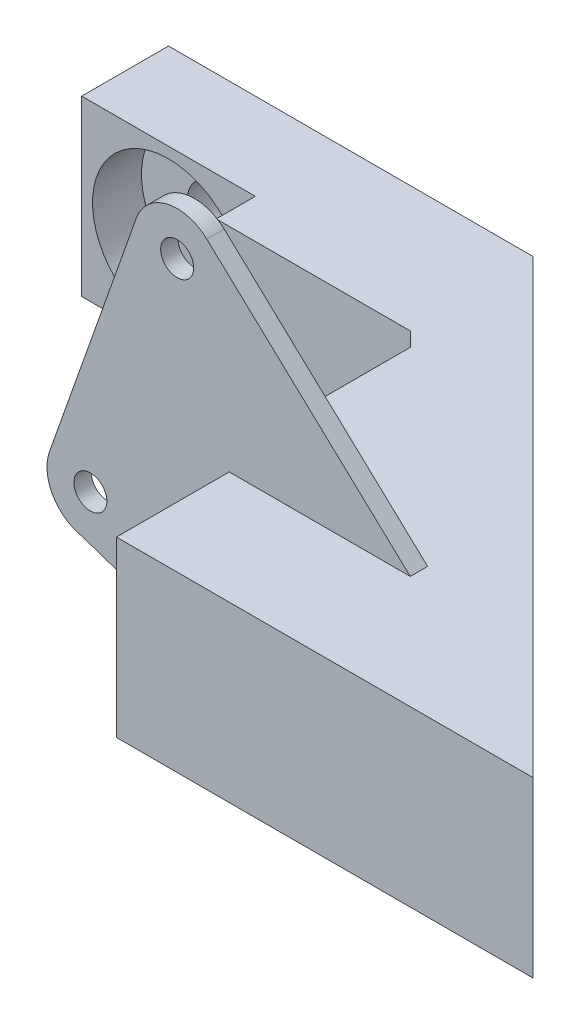
ISO-10303-21;
HEADER;
FILE_DESCRIPTION(('STEP AP214'),'2;1');
FILE_NAME('part.step','',(''),(''),'','','');
FILE_SCHEMA(('AUTOMOTIVE_DESIGN { 1 0 10303 214 1 1 1 1 }'));
ENDSEC;
DATA;
#1=APPLICATION_CONTEXT('core data for automotive mechanical design processes');
#2=APPLICATION_PROTOCOL_DEFINITION('international standard','automotive_design',2000,#1);
#3=PRODUCT_CONTEXT('',#1,'mechanical');
#4=PRODUCT('Part','Part','',(#3));
#5=PRODUCT_RELATED_PRODUCT_CATEGORY('part','',(#4));
#6=PRODUCT_DEFINITION_FORMATION('','',#4);
#7=PRODUCT_DEFINITION_CONTEXT('part definition',#1,'design');
#8=PRODUCT_DEFINITION('design','',#6,#7);
#9=PRODUCT_DEFINITION_SHAPE('','',#8);
#10=(LENGTH_UNIT() NAMED_UNIT(*) SI_UNIT(.MILLI.,.METRE.));
#11=(NAMED_UNIT(*) PLANE_ANGLE_UNIT() SI_UNIT($,.RADIAN.));
#12=(NAMED_UNIT(*) SI_UNIT($,.STERADIAN.) SOLID_ANGLE_UNIT());
#13=UNCERTAINTY_MEASURE_WITH_UNIT(LENGTH_MEASURE(1.E-05),#10,'distance_accuracy_value','');
#14=(GEOMETRIC_REPRESENTATION_CONTEXT(3) GLOBAL_UNCERTAINTY_ASSIGNED_CONTEXT((#13)) GLOBAL_UNIT_ASSIGNED_CONTEXT((#10,
#11,#12)) REPRESENTATION_CONTEXT('',''));
#15=CARTESIAN_POINT('',(0.,0.,0.));
#16=DIRECTION('',(0.,0.,1.));
#17=DIRECTION('',(1.,0.,0.));
#18=AXIS2_PLACEMENT_3D('',#15,#16,#17);
#19=CARTESIAN_POINT('',(0.,25.4,87.63));
#20=DIRECTION('',(0.,0.,1.));
#21=DIRECTION('',(1.,0.,0.));
#22=AXIS2_PLACEMENT_3D('',#19,#20,#21);
#23=PLANE('',#22);
#24=CARTESIAN_POINT('',(38.1,48.6210244842766,87.63));
#25=DIRECTION('',(0.,0.,1.));
#26=DIRECTION('',(1.,0.,0.));
#27=AXIS2_PLACEMENT_3D('',#24,#25,#26);
#28=CIRCLE('',#27,2.41299999999999);
#29=CARTESIAN_POINT('',(40.513,48.6210244842766,87.63));
#30=VERTEX_POINT('',#29);
#31=EDGE_CURVE('E301',#30,#30,#28,.F.);
#32=ORIENTED_EDGE('',*,*,#31,.F.);
#33=EDGE_LOOP('',(#32));
#34=FACE_BOUND('',#33,.T.);
#35=CARTESIAN_POINT('',(25.4,12.7,87.63));
#36=DIRECTION('',(0.,0.,1.));
#37=DIRECTION('',(1.,0.,0.));
#38=AXIS2_PLACEMENT_3D('',#35,#36,#37);
#39=CIRCLE('',#38,2.413);
#40=CARTESIAN_POINT('',(27.813,12.7,87.63));
#41=VERTEX_POINT('',#40);
#42=EDGE_CURVE('E302',#41,#41,#39,.F.);
#43=ORIENTED_EDGE('',*,*,#42,.F.);
#44=EDGE_LOOP('',(#43));
#45=FACE_BOUND('',#44,.T.);
#46=DIRECTION('',(0.730179073674294,-0.683255823515724,0.));
#47=VECTOR('',#46,1.);
#48=CARTESIAN_POINT('',(46.382207670573,49.5675503468114,87.63));
#49=LINE('',#48,#47);
#50=CARTESIAN_POINT('',(42.4386744793248,53.2576616021084,87.63));
#51=VERTEX_POINT('',#50);
#52=CARTESIAN_POINT('',(72.2094877578615,25.4,87.63));
#53=VERTEX_POINT('',#52);
#54=EDGE_CURVE('E616',#51,#53,#49,.T.);
#55=ORIENTED_EDGE('',*,*,#54,.T.);
#56=DIRECTION('',(1.,0.,0.));
#57=VECTOR('',#56,1.);
#58=CARTESIAN_POINT('',(43.18,25.4,87.63));
#59=LINE('',#58,#57);
#60=CARTESIAN_POINT('',(43.18,25.4,87.63));
#61=VERTEX_POINT('',#60);
#62=EDGE_CURVE('E59',#61,#53,#59,.T.);
#63=ORIENTED_EDGE('',*,*,#62,.F.);
#64=DIRECTION('',(0.,-1.,0.));
#65=VECTOR('',#64,1.);
#66=CARTESIAN_POINT('',(43.18,25.4,87.63));
#67=LINE('',#66,#65);
#68=CARTESIAN_POINT('',(43.18,0.,87.63));
#69=VERTEX_POINT('',#68);
#70=EDGE_CURVE('E217',#61,#69,#67,.T.);
#71=ORIENTED_EDGE('',*,*,#70,.T.);
#72=DIRECTION('',(-0.94672878074434,0.322032010381477,0.));
#73=VECTOR('',#72,1.);
#74=CARTESIAN_POINT('',(4.47796530637229,13.1645876746703,87.63));
#75=LINE('',#74,#73);
#76=CARTESIAN_POINT('',(24.1417220609686,6.47591479587988,87.63));
#77=VERTEX_POINT('',#76);
#78=EDGE_CURVE('E264',#69,#77,#75,.T.);
#79=ORIENTED_EDGE('',*,*,#78,.T.);
#80=CARTESIAN_POINT('',(25.4,12.7,87.63));
#81=DIRECTION('',(0.,0.,1.));
#82=DIRECTION('',(1.,0.,0.));
#83=AXIS2_PLACEMENT_3D('',#80,#81,#82);
#84=CIRCLE('',#83,6.35);
#85=CARTESIAN_POINT('',(19.4131625859539,14.8166666666667,87.63));
#86=VERTEX_POINT('',#85);
#87=EDGE_CURVE('E260',#77,#86,#84,.F.);
#88=ORIENTED_EDGE('',*,*,#87,.T.);
#89=DIRECTION('',(-0.333333333333333,-0.942809041582063,0.));
#90=VECTOR('',#89,1.);
#91=CARTESIAN_POINT('',(12.5997154210343,-4.45467210761702,87.63));
#92=LINE('',#91,#90);
#93=CARTESIAN_POINT('',(32.1131625859539,50.7376911509433,87.63));
#94=VERTEX_POINT('',#93);
#95=EDGE_CURVE('E250',#94,#86,#92,.T.);
#96=ORIENTED_EDGE('',*,*,#95,.F.);
#97=CARTESIAN_POINT('',(38.1,48.6210244842766,87.63));
#98=DIRECTION('',(0.,0.,1.));
#99=DIRECTION('',(1.,0.,0.));
#100=AXIS2_PLACEMENT_3D('',#97,#98,#99);
#101=CIRCLE('',#100,6.35);
#102=EDGE_CURVE('E245',#94,#51,#101,.F.);
#103=ORIENTED_EDGE('',*,*,#102,.T.);
#104=EDGE_LOOP('',(#55,#63,#71,#79,#88,#96,#103));
#105=FACE_BOUND('',#104,.T.);
#106=ADVANCED_FACE('F43',(#34,#45,#105),#23,.F.);
#107=CARTESIAN_POINT('',(0.,25.4,90.17));
#108=DIRECTION('',(0.,0.,-1.));
#109=DIRECTION('',(-1.,0.,0.));
#110=AXIS2_PLACEMENT_3D('',#107,#108,#109);
#111=PLANE('',#110);
#112=CARTESIAN_POINT('',(38.1,48.6210244842766,90.17));
#113=DIRECTION('',(0.,0.,1.));
#114=DIRECTION('',(1.,0.,0.));
#115=AXIS2_PLACEMENT_3D('',#112,#113,#114);
#116=CIRCLE('',#115,2.41299999999999);
#117=CARTESIAN_POINT('',(40.513,48.6210244842766,90.17));
#118=VERTEX_POINT('',#117);
#119=EDGE_CURVE('E297',#118,#118,#116,.T.);
#120=ORIENTED_EDGE('',*,*,#119,.F.);
#121=EDGE_LOOP('',(#120));
#122=FACE_BOUND('',#121,.T.);
#123=CARTESIAN_POINT('',(25.4,12.7,90.17));
#124=DIRECTION('',(0.,0.,1.));
#125=DIRECTION('',(1.,0.,0.));
#126=AXIS2_PLACEMENT_3D('',#123,#124,#125);
#127=CIRCLE('',#126,2.413);
#128=CARTESIAN_POINT('',(27.813,12.7,90.17));
#129=VERTEX_POINT('',#128);
#130=EDGE_CURVE('E289',#129,#129,#127,.T.);
#131=ORIENTED_EDGE('',*,*,#130,.F.);
#132=EDGE_LOOP('',(#131));
#133=FACE_BOUND('',#132,.T.);
#134=DIRECTION('',(0.,-1.,0.));
#135=VECTOR('',#134,1.);
#136=CARTESIAN_POINT('',(45.72,25.4,90.17));
#137=LINE('',#136,#135);
#138=CARTESIAN_POINT('',(45.72,25.4,90.17));
#139=VERTEX_POINT('',#138);
#140=CARTESIAN_POINT('',(45.72,0.,90.17));
#141=VERTEX_POINT('',#140);
#142=EDGE_CURVE('E214',#139,#141,#137,.T.);
#143=ORIENTED_EDGE('',*,*,#142,.F.);
#144=DIRECTION('',(-1.,0.,0.));
#145=VECTOR('',#144,1.);
#146=CARTESIAN_POINT('',(45.72,25.4,90.17));
#147=LINE('',#146,#145);
#148=CARTESIAN_POINT('',(72.2094877578615,25.4,90.17));
#149=VERTEX_POINT('',#148);
#150=EDGE_CURVE('E254',#149,#139,#147,.T.);
#151=ORIENTED_EDGE('',*,*,#150,.F.);
#152=DIRECTION('',(-0.730179073674294,0.683255823515724,0.));
#153=VECTOR('',#152,1.);
#154=CARTESIAN_POINT('',(46.382207670573,49.5675503468114,90.17));
#155=LINE('',#154,#153);
#156=CARTESIAN_POINT('',(42.4386744793248,53.2576616021084,90.17));
#157=VERTEX_POINT('',#156);
#158=EDGE_CURVE('E613',#149,#157,#155,.T.);
#159=ORIENTED_EDGE('',*,*,#158,.T.);
#160=CARTESIAN_POINT('',(38.1,48.6210244842766,90.17));
#161=DIRECTION('',(0.,0.,1.));
#162=DIRECTION('',(1.,0.,0.));
#163=AXIS2_PLACEMENT_3D('',#160,#161,#162);
#164=CIRCLE('',#163,6.35);
#165=CARTESIAN_POINT('',(32.1131625859539,50.7376911509433,90.17));
#166=VERTEX_POINT('',#165);
#167=EDGE_CURVE('E268',#157,#166,#164,.T.);
#168=ORIENTED_EDGE('',*,*,#167,.T.);
#169=DIRECTION('',(0.333333333333334,0.942809041582063,0.));
#170=VECTOR('',#169,1.);
#171=CARTESIAN_POINT('',(12.5997154210343,-4.45467210761702,90.17));
#172=LINE('',#171,#170);
#173=CARTESIAN_POINT('',(19.4131625859539,14.8166666666667,90.17));
#174=VERTEX_POINT('',#173);
#175=EDGE_CURVE('E280',#174,#166,#172,.T.);
#176=ORIENTED_EDGE('',*,*,#175,.F.);
#177=CARTESIAN_POINT('',(25.4,12.7,90.17));
#178=DIRECTION('',(0.,0.,1.));
#179=DIRECTION('',(1.,0.,0.));
#180=AXIS2_PLACEMENT_3D('',#177,#178,#179);
#181=CIRCLE('',#180,6.35);
#182=CARTESIAN_POINT('',(24.1417220609686,6.47591479587988,90.17));
#183=VERTEX_POINT('',#182);
#184=EDGE_CURVE('E276',#174,#183,#181,.T.);
#185=ORIENTED_EDGE('',*,*,#184,.T.);
#186=DIRECTION('',(0.94672878074434,-0.322032010381477,0.));
#187=VECTOR('',#186,1.);
#188=CARTESIAN_POINT('',(4.47796530637229,13.1645876746703,90.17));
#189=LINE('',#188,#187);
#190=CARTESIAN_POINT('',(43.18,0.,90.17));
#191=VERTEX_POINT('',#190);
#192=EDGE_CURVE('E272',#183,#191,#189,.T.);
#193=ORIENTED_EDGE('',*,*,#192,.T.);
#194=DIRECTION('',(1.,0.,0.));
#195=VECTOR('',#194,1.);
#196=CARTESIAN_POINT('',(0.,0.,90.17));
#197=LINE('',#196,#195);
#198=EDGE_CURVE('E171',#191,#141,#197,.T.);
#199=ORIENTED_EDGE('',*,*,#198,.T.);
#200=EDGE_LOOP('',(#143,#151,#159,#168,#176,#185,#193,#199));
#201=FACE_BOUND('',#200,.T.);
#202=ADVANCED_FACE('F359',(#122,#133,#201),#111,.F.);
#203=CARTESIAN_POINT('',(43.18,25.4,0.));
#204=DIRECTION('',(1.,0.,0.));
#205=DIRECTION('',(0.,0.,-1.));
#206=AXIS2_PLACEMENT_3D('',#203,#204,#205);
#207=PLANE('',#206);
#208=DIRECTION('',(0.,0.,1.));
#209=VECTOR('',#208,1.);
#210=CARTESIAN_POINT('',(43.18,25.4,61.1405122421384));
#211=LINE('',#210,#209);
#212=CARTESIAN_POINT('',(43.18,25.4,61.1405122421384));
#213=VERTEX_POINT('',#212);
#214=EDGE_CURVE('E229',#213,#61,#211,.T.);
#215=ORIENTED_EDGE('',*,*,#214,.F.);
#216=DIRECTION('',(0.,-1.,0.));
#217=VECTOR('',#216,1.);
#218=CARTESIAN_POINT('',(43.18,25.4,61.1405122421384));
#219=LINE('',#218,#217);
#220=CARTESIAN_POINT('',(43.18,0.,61.1405122421384));
#221=VERTEX_POINT('',#220);
#222=EDGE_CURVE('E52',#213,#221,#219,.T.);
#223=ORIENTED_EDGE('',*,*,#222,.T.);
#224=DIRECTION('',(0.,0.,1.));
#225=VECTOR('',#224,1.);
#226=CARTESIAN_POINT('',(43.18,0.,0.));
#227=LINE('',#226,#225);
#228=EDGE_CURVE('E167',#221,#69,#227,.T.);
#229=ORIENTED_EDGE('',*,*,#228,.T.);
#230=ORIENTED_EDGE('',*,*,#70,.F.);
#231=EDGE_LOOP('',(#215,#223,#229,#230));
#232=FACE_BOUND('',#231,.T.);
#233=ADVANCED_FACE('F225',(#232),#207,.F.);
#234=CARTESIAN_POINT('',(0.,0.,0.));
#235=DIRECTION('',(0.,1.,0.));
#236=DIRECTION('',(0.,0.,1.));
#237=AXIS2_PLACEMENT_3D('',#234,#235,#236);
#238=PLANE('',#237);
#239=DIRECTION('',(0.,0.,1.));
#240=VECTOR('',#239,1.);
#241=CARTESIAN_POINT('',(43.18,0.,40.639));
#242=LINE('',#241,#240);
#243=EDGE_CURVE('E236',#69,#191,#242,.T.);
#244=ORIENTED_EDGE('',*,*,#243,.F.);
#245=ORIENTED_EDGE('',*,*,#228,.F.);
#246=DIRECTION('',(0.707106781186546,0.,0.707106781186549));
#247=VECTOR('',#246,1.);
#248=CARTESIAN_POINT('',(-8.98025612106915,0.,8.98025612106912));
#249=LINE('',#248,#247);
#250=CARTESIAN_POINT('',(41.0944877578616,0.,59.055));
#251=VERTEX_POINT('',#250);
#252=EDGE_CURVE('E163',#251,#221,#249,.T.);
#253=ORIENTED_EDGE('',*,*,#252,.F.);
#254=DIRECTION('',(1.,0.,0.));
#255=VECTOR('',#254,1.);
#256=CARTESIAN_POINT('',(0.,0.,59.055));
#257=LINE('',#256,#255);
#258=CARTESIAN_POINT('',(12.7,0.,59.055));
#259=VERTEX_POINT('',#258);
#260=EDGE_CURVE('E159',#259,#251,#257,.T.);
#261=ORIENTED_EDGE('',*,*,#260,.F.);
#262=DIRECTION('',(0.,0.,1.));
#263=VECTOR('',#262,1.);
#264=CARTESIAN_POINT('',(12.7,0.,0.));
#265=LINE('',#264,#263);
#266=CARTESIAN_POINT('',(12.7,0.,53.34));
#267=VERTEX_POINT('',#266);
#268=EDGE_CURVE('E106',#267,#259,#265,.T.);
#269=ORIENTED_EDGE('',*,*,#268,.F.);
#270=DIRECTION('',(-1.,0.,0.));
#271=VECTOR('',#270,1.);
#272=CARTESIAN_POINT('',(0.,0.,53.34));
#273=LINE('',#272,#271);
#274=CARTESIAN_POINT('',(-12.7,0.,53.34));
#275=VERTEX_POINT('',#274);
#276=EDGE_CURVE('E192',#267,#275,#273,.T.);
#277=ORIENTED_EDGE('',*,*,#276,.T.);
#278=DIRECTION('',(0.,0.,-1.));
#279=VECTOR('',#278,1.);
#280=CARTESIAN_POINT('',(-12.7,0.,0.));
#281=LINE('',#280,#279);
#282=CARTESIAN_POINT('',(-12.7,0.,40.64));
#283=VERTEX_POINT('',#282);
#284=EDGE_CURVE('E134',#275,#283,#281,.T.);
#285=ORIENTED_EDGE('',*,*,#284,.T.);
#286=DIRECTION('',(1.,0.,0.));
#287=VECTOR('',#286,1.);
#288=CARTESIAN_POINT('',(0.,0.,40.64));
#289=LINE('',#288,#287);
#290=CARTESIAN_POINT('',(40.6399999999999,0.,40.64));
#291=VERTEX_POINT('',#290);
#292=EDGE_CURVE('E186',#283,#291,#289,.T.);
#293=ORIENTED_EDGE('',*,*,#292,.T.);
#294=DIRECTION('',(0.707106781186546,0.,0.707106781186549));
#295=VECTOR('',#294,1.);
#296=CARTESIAN_POINT('',(0.,0.,0.));
#297=LINE('',#296,#295);
#298=CARTESIAN_POINT('',(106.68,0.,106.68));
#299=VERTEX_POINT('',#298);
#300=EDGE_CURVE('E182',#291,#299,#297,.T.);
#301=ORIENTED_EDGE('',*,*,#300,.T.);
#302=DIRECTION('',(1.,0.,0.));
#303=VECTOR('',#302,1.);
#304=CARTESIAN_POINT('',(0.,0.,106.68));
#305=LINE('',#304,#303);
#306=CARTESIAN_POINT('',(45.72,0.,106.68));
#307=VERTEX_POINT('',#306);
#308=EDGE_CURVE('E179',#307,#299,#305,.T.);
#309=ORIENTED_EDGE('',*,*,#308,.F.);
#310=DIRECTION('',(0.,0.,1.));
#311=VECTOR('',#310,1.);
#312=CARTESIAN_POINT('',(45.72,0.,0.));
#313=LINE('',#312,#311);
#314=EDGE_CURVE('E175',#141,#307,#313,.T.);
#315=ORIENTED_EDGE('',*,*,#314,.F.);
#316=ORIENTED_EDGE('',*,*,#198,.F.);
#317=EDGE_LOOP('',(#244,#245,#253,#261,#269,#277,#285,#293,#301,#309,#315,#316));
#318=FACE_BOUND('',#317,.T.);
#319=ADVANCED_FACE('F232',(#318),#238,.F.);
#320=CARTESIAN_POINT('',(45.72,25.4,0.));
#321=DIRECTION('',(1.,0.,0.));
#322=DIRECTION('',(0.,0.,-1.));
#323=AXIS2_PLACEMENT_3D('',#320,#321,#322);
#324=PLANE('',#323);
#325=DIRECTION('',(0.,-1.,0.));
#326=VECTOR('',#325,1.);
#327=CARTESIAN_POINT('',(45.72,25.4,106.68));
#328=LINE('',#327,#326);
#329=CARTESIAN_POINT('',(45.72,25.4,106.68));
#330=VERTEX_POINT('',#329);
#331=EDGE_CURVE('E211',#330,#307,#328,.T.);
#332=ORIENTED_EDGE('',*,*,#331,.F.);
#333=DIRECTION('',(0.,0.,1.));
#334=VECTOR('',#333,1.);
#335=CARTESIAN_POINT('',(45.72,25.4,106.68));
#336=LINE('',#335,#334);
#337=EDGE_CURVE('E625',#139,#330,#336,.T.);
#338=ORIENTED_EDGE('',*,*,#337,.F.);
#339=ORIENTED_EDGE('',*,*,#142,.T.);
#340=ORIENTED_EDGE('',*,*,#314,.T.);
#341=EDGE_LOOP('',(#332,#338,#339,#340));
#342=FACE_BOUND('',#341,.T.);
#343=ADVANCED_FACE('F389',(#342),#324,.F.);
#344=CARTESIAN_POINT('',(0.,25.4,106.68));
#345=DIRECTION('',(0.,0.,-1.));
#346=DIRECTION('',(-1.,0.,0.));
#347=AXIS2_PLACEMENT_3D('',#344,#345,#346);
#348=PLANE('',#347);
#349=DIRECTION('',(1.,0.,0.));
#350=VECTOR('',#349,1.);
#351=CARTESIAN_POINT('',(0.,25.4,106.68));
#352=LINE('',#351,#350);
#353=CARTESIAN_POINT('',(106.68,25.4,106.68));
#354=VERTEX_POINT('',#353);
#355=EDGE_CURVE('E331',#330,#354,#352,.T.);
#356=ORIENTED_EDGE('',*,*,#355,.F.);
#357=ORIENTED_EDGE('',*,*,#331,.T.);
#358=ORIENTED_EDGE('',*,*,#308,.T.);
#359=DIRECTION('',(0.,-1.,0.));
#360=VECTOR('',#359,1.);
#361=CARTESIAN_POINT('',(106.68,25.4,106.68));
#362=LINE('',#361,#360);
#363=EDGE_CURVE('E207',#354,#299,#362,.T.);
#364=ORIENTED_EDGE('',*,*,#363,.F.);
#365=EDGE_LOOP('',(#356,#357,#358,#364));
#366=FACE_BOUND('',#365,.T.);
#367=ADVANCED_FACE('F385',(#366),#348,.F.);
#368=CARTESIAN_POINT('',(0.,25.4,59.055));
#369=DIRECTION('',(0.,0.,-1.));
#370=DIRECTION('',(-1.,0.,0.));
#371=AXIS2_PLACEMENT_3D('',#368,#369,#370);
#372=PLANE('',#371);
#373=ORIENTED_EDGE('',*,*,#260,.T.);
#374=DIRECTION('',(0.,-1.,0.));
#375=VECTOR('',#374,1.);
#376=CARTESIAN_POINT('',(41.0944877578616,25.4,59.055));
#377=LINE('',#376,#375);
#378=CARTESIAN_POINT('',(41.0944877578616,25.4,59.055));
#379=VERTEX_POINT('',#378);
#380=EDGE_CURVE('E12',#379,#251,#377,.T.);
#381=ORIENTED_EDGE('',*,*,#380,.F.);
#382=DIRECTION('',(1.,0.,0.));
#383=VECTOR('',#382,1.);
#384=CARTESIAN_POINT('',(0.,25.4,59.055));
#385=LINE('',#384,#383);
#386=CARTESIAN_POINT('',(12.7,25.4,59.055));
#387=VERTEX_POINT('',#386);
#388=EDGE_CURVE('E197',#387,#379,#385,.T.);
#389=ORIENTED_EDGE('',*,*,#388,.F.);
#390=DIRECTION('',(0.,-1.,0.));
#391=VECTOR('',#390,1.);
#392=CARTESIAN_POINT('',(12.7,25.4,59.055));
#393=LINE('',#392,#391);
#394=EDGE_CURVE('E155',#387,#259,#393,.T.);
#395=ORIENTED_EDGE('',*,*,#394,.T.);
#396=EDGE_LOOP('',(#373,#381,#389,#395));
#397=FACE_BOUND('',#396,.T.);
#398=ADVANCED_FACE('F45',(#397),#372,.F.);
#399=CARTESIAN_POINT('',(-8.98025612106915,25.4,8.98025612106912));
#400=DIRECTION('',(0.707106781186549,0.,-0.707106781186546));
#401=DIRECTION('',(-0.707106781186546,0.,-0.707106781186549));
#402=AXIS2_PLACEMENT_3D('',#399,#400,#401);
#403=PLANE('',#402);
#404=ORIENTED_EDGE('',*,*,#252,.T.);
#405=ORIENTED_EDGE('',*,*,#222,.F.);
#406=DIRECTION('',(0.707106781186546,0.,0.707106781186549));
#407=VECTOR('',#406,1.);
#408=CARTESIAN_POINT('',(-8.98025612106915,25.4,8.98025612106912));
#409=LINE('',#408,#407);
#410=EDGE_CURVE('E114',#379,#213,#409,.T.);
#411=ORIENTED_EDGE('',*,*,#410,.F.);
#412=ORIENTED_EDGE('',*,*,#380,.T.);
#413=EDGE_LOOP('',(#404,#405,#411,#412));
#414=FACE_BOUND('',#413,.T.);
#415=ADVANCED_FACE('F374',(#414),#403,.F.);
#416=CARTESIAN_POINT('',(0.,25.4,0.));
#417=DIRECTION('',(0.707106781186549,0.,-0.707106781186546));
#418=DIRECTION('',(-0.707106781186546,0.,-0.707106781186549));
#419=AXIS2_PLACEMENT_3D('',#416,#417,#418);
#420=PLANE('',#419);
#421=ORIENTED_EDGE('',*,*,#300,.F.);
#422=DIRECTION('',(0.,-1.,0.));
#423=VECTOR('',#422,1.);
#424=CARTESIAN_POINT('',(40.6399999999999,25.4,40.64));
#425=LINE('',#424,#423);
#426=CARTESIAN_POINT('',(40.6399999999999,25.4,40.64));
#427=VERTEX_POINT('',#426);
#428=EDGE_CURVE('E204',#427,#291,#425,.T.);
#429=ORIENTED_EDGE('',*,*,#428,.F.);
#430=DIRECTION('',(0.707106781186546,0.,0.707106781186549));
#431=VECTOR('',#430,1.);
#432=CARTESIAN_POINT('',(0.,25.4,0.));
#433=LINE('',#432,#431);
#434=EDGE_CURVE('E334',#427,#354,#433,.T.);
#435=ORIENTED_EDGE('',*,*,#434,.T.);
#436=ORIENTED_EDGE('',*,*,#363,.T.);
#437=EDGE_LOOP('',(#421,#429,#435,#436));
#438=FACE_BOUND('',#437,.T.);
#439=ADVANCED_FACE('F376',(#438),#420,.T.);
#440=CARTESIAN_POINT('',(0.,25.4,40.64));
#441=DIRECTION('',(0.,0.,-1.));
#442=DIRECTION('',(-1.,0.,0.));
#443=AXIS2_PLACEMENT_3D('',#440,#441,#442);
#444=PLANE('',#443);
#445=CARTESIAN_POINT('',(0.,12.7,40.64));
#446=DIRECTION('',(0.,0.,-1.));
#447=DIRECTION('',(-1.,0.,0.));
#448=AXIS2_PLACEMENT_3D('',#445,#446,#447);
#449=CIRCLE('',#448,4.445);
#450=CARTESIAN_POINT('',(-4.445,12.7,40.64));
#451=VERTEX_POINT('',#450);
#452=EDGE_CURVE('E316',#451,#451,#449,.F.);
#453=ORIENTED_EDGE('',*,*,#452,.T.);
#454=EDGE_LOOP('',(#453));
#455=FACE_BOUND('',#454,.T.);
#456=ORIENTED_EDGE('',*,*,#292,.F.);
#457=DIRECTION('',(0.,-1.,0.));
#458=VECTOR('',#457,1.);
#459=CARTESIAN_POINT('',(-12.7,25.4,40.64));
#460=LINE('',#459,#458);
#461=CARTESIAN_POINT('',(-12.7,25.4,40.64));
#462=VERTEX_POINT('',#461);
#463=EDGE_CURVE('E140',#462,#283,#460,.T.);
#464=ORIENTED_EDGE('',*,*,#463,.F.);
#465=DIRECTION('',(1.,0.,0.));
#466=VECTOR('',#465,1.);
#467=CARTESIAN_POINT('',(0.,25.4,40.64));
#468=LINE('',#467,#466);
#469=EDGE_CURVE('E148',#462,#427,#468,.T.);
#470=ORIENTED_EDGE('',*,*,#469,.T.);
#471=ORIENTED_EDGE('',*,*,#428,.T.);
#472=EDGE_LOOP('',(#456,#464,#470,#471));
#473=FACE_BOUND('',#472,.T.);
#474=ADVANCED_FACE('F340',(#455,#473),#444,.T.);
#475=CARTESIAN_POINT('',(-12.7,25.4,0.));
#476=DIRECTION('',(-1.,0.,0.));
#477=DIRECTION('',(0.,0.,1.));
#478=AXIS2_PLACEMENT_3D('',#475,#476,#477);
#479=PLANE('',#478);
#480=ORIENTED_EDGE('',*,*,#284,.F.);
#481=DIRECTION('',(0.,-1.,0.));
#482=VECTOR('',#481,1.);
#483=CARTESIAN_POINT('',(-12.7,25.4,53.34));
#484=LINE('',#483,#482);
#485=CARTESIAN_POINT('',(-12.7,25.4,53.34));
#486=VERTEX_POINT('',#485);
#487=EDGE_CURVE('E129',#486,#275,#484,.T.);
#488=ORIENTED_EDGE('',*,*,#487,.F.);
#489=DIRECTION('',(0.,0.,-1.));
#490=VECTOR('',#489,1.);
#491=CARTESIAN_POINT('',(-12.7,25.4,0.));
#492=LINE('',#491,#490);
#493=EDGE_CURVE('E132',#486,#462,#492,.T.);
#494=ORIENTED_EDGE('',*,*,#493,.T.);
#495=ORIENTED_EDGE('',*,*,#463,.T.);
#496=EDGE_LOOP('',(#480,#488,#494,#495));
#497=FACE_BOUND('',#496,.T.);
#498=ADVANCED_FACE('F131',(#497),#479,.T.);
#499=CARTESIAN_POINT('',(0.,25.4,53.34));
#500=DIRECTION('',(0.,0.,1.));
#501=DIRECTION('',(1.,0.,0.));
#502=AXIS2_PLACEMENT_3D('',#499,#500,#501);
#503=PLANE('',#502);
#504=CARTESIAN_POINT('',(0.,12.7,53.34));
#505=DIRECTION('',(0.,0.,1.));
#506=DIRECTION('',(1.,0.,0.));
#507=AXIS2_PLACEMENT_3D('',#504,#505,#506);
#508=CIRCLE('',#507,11.1125);
#509=CARTESIAN_POINT('',(11.1125,12.7,53.34));
#510=VERTEX_POINT('',#509);
#511=EDGE_CURVE('E320',#510,#510,#508,.T.);
#512=ORIENTED_EDGE('',*,*,#511,.F.);
#513=EDGE_LOOP('',(#512));
#514=FACE_BOUND('',#513,.T.);
#515=ORIENTED_EDGE('',*,*,#276,.F.);
#516=DIRECTION('',(0.,-1.,0.));
#517=VECTOR('',#516,1.);
#518=CARTESIAN_POINT('',(12.7,25.4,53.34));
#519=LINE('',#518,#517);
#520=CARTESIAN_POINT('',(12.7,25.4,53.34));
#521=VERTEX_POINT('',#520);
#522=EDGE_CURVE('E141',#521,#267,#519,.T.);
#523=ORIENTED_EDGE('',*,*,#522,.F.);
#524=DIRECTION('',(-1.,0.,0.));
#525=VECTOR('',#524,1.);
#526=CARTESIAN_POINT('',(0.,25.4,53.34));
#527=LINE('',#526,#525);
#528=EDGE_CURVE('E145',#521,#486,#527,.T.);
#529=ORIENTED_EDGE('',*,*,#528,.T.);
#530=ORIENTED_EDGE('',*,*,#487,.T.);
#531=EDGE_LOOP('',(#515,#523,#529,#530));
#532=FACE_BOUND('',#531,.T.);
#533=ADVANCED_FACE('F151',(#514,#532),#503,.T.);
#534=CARTESIAN_POINT('',(12.7,25.4,0.));
#535=DIRECTION('',(1.,0.,0.));
#536=DIRECTION('',(0.,0.,-1.));
#537=AXIS2_PLACEMENT_3D('',#534,#535,#536);
#538=PLANE('',#537);
#539=ORIENTED_EDGE('',*,*,#268,.T.);
#540=ORIENTED_EDGE('',*,*,#394,.F.);
#541=DIRECTION('',(0.,0.,1.));
#542=VECTOR('',#541,1.);
#543=CARTESIAN_POINT('',(12.7,25.4,0.));
#544=LINE('',#543,#542);
#545=EDGE_CURVE('E67',#521,#387,#544,.T.);
#546=ORIENTED_EDGE('',*,*,#545,.F.);
#547=ORIENTED_EDGE('',*,*,#522,.T.);
#548=EDGE_LOOP('',(#539,#540,#546,#547));
#549=FACE_BOUND('',#548,.T.);
#550=ADVANCED_FACE('F345',(#549),#538,.F.);
#551=CARTESIAN_POINT('',(0.,25.4,0.));
#552=DIRECTION('',(0.,1.,0.));
#553=DIRECTION('',(0.,0.,1.));
#554=AXIS2_PLACEMENT_3D('',#551,#552,#553);
#555=PLANE('',#554);
#556=DIRECTION('',(0.,0.,1.));
#557=VECTOR('',#556,1.);
#558=CARTESIAN_POINT('',(72.2094877578615,25.4,83.9752466071334));
#559=LINE('',#558,#557);
#560=EDGE_CURVE('E627',#53,#149,#559,.T.);
#561=ORIENTED_EDGE('',*,*,#560,.T.);
#562=ORIENTED_EDGE('',*,*,#150,.T.);
#563=ORIENTED_EDGE('',*,*,#337,.T.);
#564=ORIENTED_EDGE('',*,*,#355,.T.);
#565=ORIENTED_EDGE('',*,*,#434,.F.);
#566=ORIENTED_EDGE('',*,*,#469,.F.);
#567=ORIENTED_EDGE('',*,*,#493,.F.);
#568=ORIENTED_EDGE('',*,*,#528,.F.);
#569=ORIENTED_EDGE('',*,*,#545,.T.);
#570=ORIENTED_EDGE('',*,*,#388,.T.);
#571=ORIENTED_EDGE('',*,*,#410,.T.);
#572=ORIENTED_EDGE('',*,*,#214,.T.);
#573=ORIENTED_EDGE('',*,*,#62,.T.);
#574=EDGE_LOOP('',(#561,#562,#563,#564,#565,#566,#567,#568,#569,#570,#571,#572,#573));
#575=FACE_BOUND('',#574,.T.);
#576=ADVANCED_FACE('F144',(#575),#555,.T.);
#577=CARTESIAN_POINT('',(0.,12.7,46.1772));
#578=DIRECTION('',(0.,0.,1.));
#579=DIRECTION('',(1.,0.,0.));
#580=AXIS2_PLACEMENT_3D('',#577,#578,#579);
#581=CYLINDRICAL_SURFACE('',#580,11.1125);
#582=CARTESIAN_POINT('',(0.,12.7,46.1772));
#583=DIRECTION('',(0.,0.,1.));
#584=DIRECTION('',(1.,0.,0.));
#585=AXIS2_PLACEMENT_3D('',#582,#583,#584);
#586=CIRCLE('',#585,11.1125);
#587=CARTESIAN_POINT('',(11.1125,12.7,46.1772));
#588=VERTEX_POINT('',#587);
#589=EDGE_CURVE('E164',#588,#588,#586,.T.);
#590=ORIENTED_EDGE('',*,*,#589,.F.);
#591=EDGE_LOOP('',(#590));
#592=FACE_BOUND('',#591,.T.);
#593=ORIENTED_EDGE('',*,*,#511,.T.);
#594=EDGE_LOOP('',(#593));
#595=FACE_BOUND('',#594,.T.);
#596=ADVANCED_FACE('F353',(#592,#595),#581,.F.);
#597=CARTESIAN_POINT('',(0.,12.7,46.1772));
#598=DIRECTION('',(0.,0.,1.));
#599=DIRECTION('',(1.,0.,0.));
#600=AXIS2_PLACEMENT_3D('',#597,#598,#599);
#601=PLANE('',#600);
#602=CARTESIAN_POINT('',(0.,12.7,46.1772));
#603=DIRECTION('',(0.,0.,1.));
#604=DIRECTION('',(1.,0.,0.));
#605=AXIS2_PLACEMENT_3D('',#602,#603,#604);
#606=CIRCLE('',#605,4.445);
#607=CARTESIAN_POINT('',(4.445,12.7,46.1772));
#608=VERTEX_POINT('',#607);
#609=EDGE_CURVE('E306',#608,#608,#606,.F.);
#610=ORIENTED_EDGE('',*,*,#609,.T.);
#611=EDGE_LOOP('',(#610));
#612=FACE_BOUND('',#611,.T.);
#613=ORIENTED_EDGE('',*,*,#589,.T.);
#614=EDGE_LOOP('',(#613));
#615=FACE_BOUND('',#614,.T.);
#616=ADVANCED_FACE('F420',(#612,#615),#601,.T.);
#617=CARTESIAN_POINT('',(0.,12.7,40.639));
#618=DIRECTION('',(0.,0.,1.));
#619=DIRECTION('',(1.,0.,0.));
#620=AXIS2_PLACEMENT_3D('',#617,#618,#619);
#621=CYLINDRICAL_SURFACE('',#620,4.445);
#622=ORIENTED_EDGE('',*,*,#452,.F.);
#623=EDGE_LOOP('',(#622));
#624=FACE_BOUND('',#623,.T.);
#625=ORIENTED_EDGE('',*,*,#609,.F.);
#626=EDGE_LOOP('',(#625));
#627=FACE_BOUND('',#626,.T.);
#628=ADVANCED_FACE('F437',(#624,#627),#621,.F.);
#629=CARTESIAN_POINT('',(25.4,12.7,40.639));
#630=DIRECTION('',(0.,0.,1.));
#631=DIRECTION('',(1.,0.,0.));
#632=AXIS2_PLACEMENT_3D('',#629,#630,#631);
#633=CYLINDRICAL_SURFACE('',#632,2.413);
#634=ORIENTED_EDGE('',*,*,#130,.T.);
#635=EDGE_LOOP('',(#634));
#636=FACE_BOUND('',#635,.T.);
#637=ORIENTED_EDGE('',*,*,#42,.T.);
#638=EDGE_LOOP('',(#637));
#639=FACE_BOUND('',#638,.T.);
#640=ADVANCED_FACE('F447',(#636,#639),#633,.F.);
#641=CARTESIAN_POINT('',(38.1,48.6210244842766,40.639));
#642=DIRECTION('',(0.,0.,1.));
#643=DIRECTION('',(1.,0.,0.));
#644=AXIS2_PLACEMENT_3D('',#641,#642,#643);
#645=CYLINDRICAL_SURFACE('',#644,2.41299999999999);
#646=ORIENTED_EDGE('',*,*,#119,.T.);
#647=EDGE_LOOP('',(#646));
#648=FACE_BOUND('',#647,.T.);
#649=ORIENTED_EDGE('',*,*,#31,.T.);
#650=EDGE_LOOP('',(#649));
#651=FACE_BOUND('',#650,.T.);
#652=ADVANCED_FACE('F458',(#648,#651),#645,.F.);
#653=CARTESIAN_POINT('',(4.47796530637229,13.1645876746703,40.639));
#654=DIRECTION('',(-0.322032010381477,-0.94672878074434,0.));
#655=DIRECTION('',(0.94672878074434,-0.322032010381477,0.));
#656=AXIS2_PLACEMENT_3D('',#653,#654,#655);
#657=PLANE('',#656);
#658=ORIENTED_EDGE('',*,*,#78,.F.);
#659=ORIENTED_EDGE('',*,*,#243,.T.);
#660=ORIENTED_EDGE('',*,*,#192,.F.);
#661=DIRECTION('',(0.,0.,1.));
#662=VECTOR('',#661,1.);
#663=CARTESIAN_POINT('',(24.1417220609686,6.47591479587988,40.639));
#664=LINE('',#663,#662);
#665=EDGE_CURVE('E284',#77,#183,#664,.T.);
#666=ORIENTED_EDGE('',*,*,#665,.F.);
#667=EDGE_LOOP('',(#658,#659,#660,#666));
#668=FACE_BOUND('',#667,.T.);
#669=ADVANCED_FACE('F468',(#668),#657,.T.);
#670=CARTESIAN_POINT('',(25.4,12.7,40.639));
#671=DIRECTION('',(0.,0.,1.));
#672=DIRECTION('',(1.,0.,0.));
#673=AXIS2_PLACEMENT_3D('',#670,#671,#672);
#674=CYLINDRICAL_SURFACE('',#673,6.35);
#675=ORIENTED_EDGE('',*,*,#665,.T.);
#676=ORIENTED_EDGE('',*,*,#184,.F.);
#677=DIRECTION('',(0.,0.,1.));
#678=VECTOR('',#677,1.);
#679=CARTESIAN_POINT('',(19.4131625859539,14.8166666666667,40.639));
#680=LINE('',#679,#678);
#681=EDGE_CURVE('E290',#86,#174,#680,.T.);
#682=ORIENTED_EDGE('',*,*,#681,.F.);
#683=ORIENTED_EDGE('',*,*,#87,.F.);
#684=EDGE_LOOP('',(#675,#676,#682,#683));
#685=FACE_BOUND('',#684,.T.);
#686=ADVANCED_FACE('F476',(#685),#674,.T.);
#687=CARTESIAN_POINT('',(12.5997154210343,-4.45467210761702,40.639));
#688=DIRECTION('',(0.942809041582063,-0.333333333333333,0.));
#689=DIRECTION('',(0.333333333333333,0.942809041582063,0.));
#690=AXIS2_PLACEMENT_3D('',#687,#688,#689);
#691=PLANE('',#690);
#692=ORIENTED_EDGE('',*,*,#95,.T.);
#693=ORIENTED_EDGE('',*,*,#681,.T.);
#694=ORIENTED_EDGE('',*,*,#175,.T.);
#695=DIRECTION('',(0.,0.,1.));
#696=VECTOR('',#695,1.);
#697=CARTESIAN_POINT('',(32.1131625859539,50.7376911509433,40.639));
#698=LINE('',#697,#696);
#699=EDGE_CURVE('E285',#94,#166,#698,.T.);
#700=ORIENTED_EDGE('',*,*,#699,.F.);
#701=EDGE_LOOP('',(#692,#693,#694,#700));
#702=FACE_BOUND('',#701,.T.);
#703=ADVANCED_FACE('F481',(#702),#691,.F.);
#704=CARTESIAN_POINT('',(38.1,48.6210244842766,40.639));
#705=DIRECTION('',(0.,0.,1.));
#706=DIRECTION('',(1.,0.,0.));
#707=AXIS2_PLACEMENT_3D('',#704,#705,#706);
#708=CYLINDRICAL_SURFACE('',#707,6.35);
#709=ORIENTED_EDGE('',*,*,#699,.T.);
#710=ORIENTED_EDGE('',*,*,#167,.F.);
#711=DIRECTION('',(0.,0.,1.));
#712=VECTOR('',#711,1.);
#713=CARTESIAN_POINT('',(42.4386744793248,53.2576616021084,40.639));
#714=LINE('',#713,#712);
#715=EDGE_CURVE('E609',#51,#157,#714,.T.);
#716=ORIENTED_EDGE('',*,*,#715,.F.);
#717=ORIENTED_EDGE('',*,*,#102,.F.);
#718=EDGE_LOOP('',(#709,#710,#716,#717));
#719=FACE_BOUND('',#718,.T.);
#720=ADVANCED_FACE('F491',(#719),#708,.T.);
#721=CARTESIAN_POINT('',(46.382207670573,49.5675503468114,40.639));
#722=DIRECTION('',(0.683255823515724,0.730179073674293,0.));
#723=DIRECTION('',(-0.730179073674294,0.683255823515724,0.));
#724=AXIS2_PLACEMENT_3D('',#721,#722,#723);
#725=PLANE('',#724);
#726=ORIENTED_EDGE('',*,*,#715,.T.);
#727=ORIENTED_EDGE('',*,*,#158,.F.);
#728=ORIENTED_EDGE('',*,*,#560,.F.);
#729=ORIENTED_EDGE('',*,*,#54,.F.);
#730=EDGE_LOOP('',(#726,#727,#728,#729));
#731=FACE_BOUND('',#730,.T.);
#732=ADVANCED_FACE('F538',(#731),#725,.T.);
#733=CLOSED_SHELL('',(#106,#202,#233,#319,#343,#367,#398,#415,#439,#474,#498,#533,#550,#576,
#596,#616,#628,#640,#652,#669,#686,#703,#720,#732));
#734=MANIFOLD_SOLID_BREP('B2',#733);
#735=ADVANCED_BREP_SHAPE_REPRESENTATION('',(#18,#734),#14);
#736=SHAPE_DEFINITION_REPRESENTATION(#9,#735);
ENDSEC;
END-ISO-10303-21;
